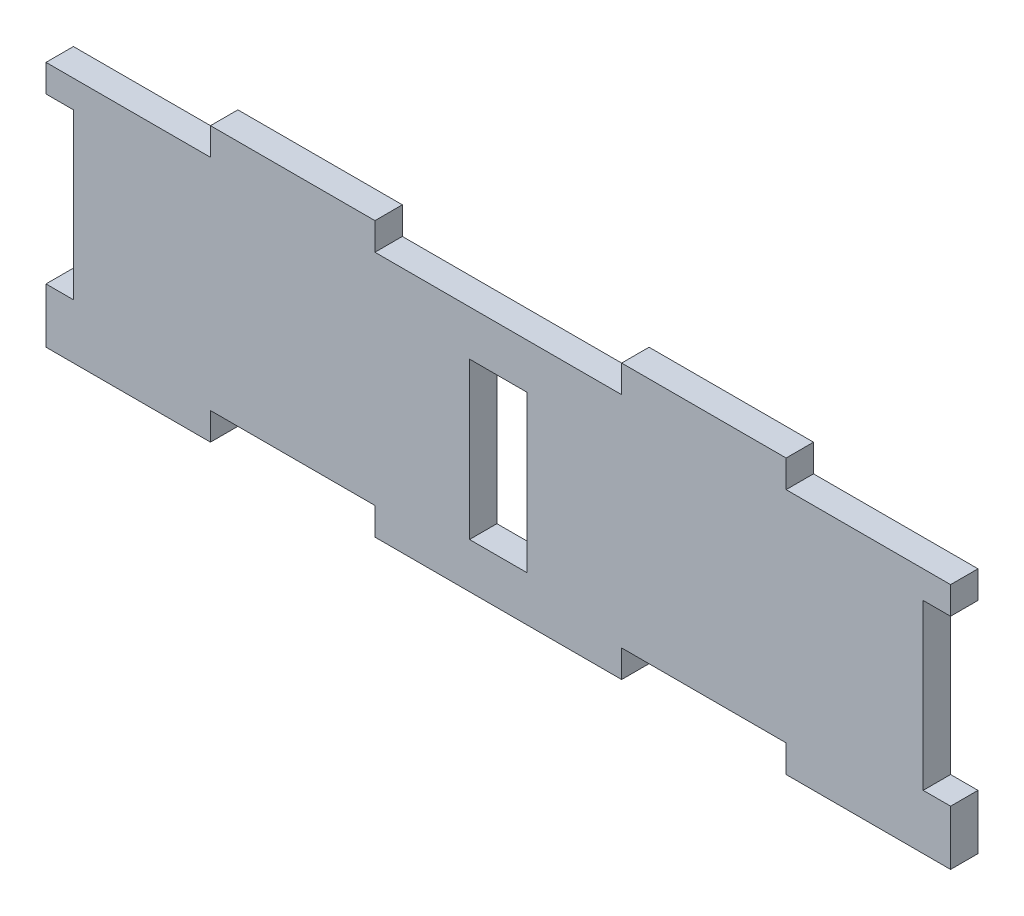
ISO-10303-21;
HEADER;
FILE_DESCRIPTION(('STEP AP214'),'2;1');
FILE_NAME('part.step','',(''),(''),'','','');
FILE_SCHEMA(('AUTOMOTIVE_DESIGN { 1 0 10303 214 1 1 1 1 }'));
ENDSEC;
DATA;
#1=APPLICATION_CONTEXT('core data for automotive mechanical design processes');
#2=APPLICATION_PROTOCOL_DEFINITION('international standard','automotive_design',2000,#1);
#3=PRODUCT_CONTEXT('',#1,'mechanical');
#4=PRODUCT('Part','Part','',(#3));
#5=PRODUCT_RELATED_PRODUCT_CATEGORY('part','',(#4));
#6=PRODUCT_DEFINITION_FORMATION('','',#4);
#7=PRODUCT_DEFINITION_CONTEXT('part definition',#1,'design');
#8=PRODUCT_DEFINITION('design','',#6,#7);
#9=PRODUCT_DEFINITION_SHAPE('','',#8);
#10=(LENGTH_UNIT() NAMED_UNIT(*) SI_UNIT(.MILLI.,.METRE.));
#11=(NAMED_UNIT(*) PLANE_ANGLE_UNIT() SI_UNIT($,.RADIAN.));
#12=(NAMED_UNIT(*) SI_UNIT($,.STERADIAN.) SOLID_ANGLE_UNIT());
#13=UNCERTAINTY_MEASURE_WITH_UNIT(LENGTH_MEASURE(1.E-05),#10,'distance_accuracy_value','');
#14=(GEOMETRIC_REPRESENTATION_CONTEXT(3) GLOBAL_UNCERTAINTY_ASSIGNED_CONTEXT((#13)) GLOBAL_UNIT_ASSIGNED_CONTEXT((#10,
#11,#12)) REPRESENTATION_CONTEXT('',''));
#15=CARTESIAN_POINT('',(0.,0.,0.));
#16=DIRECTION('',(0.,0.,1.));
#17=DIRECTION('',(1.,0.,0.));
#18=AXIS2_PLACEMENT_3D('',#15,#16,#17);
#19=CARTESIAN_POINT('',(-20.7430089491256,50.7784971444489,5.));
#20=DIRECTION('',(0.,0.,-1.));
#21=DIRECTION('',(-1.,0.,0.));
#22=AXIS2_PLACEMENT_3D('',#19,#20,#21);
#23=PLANE('',#22);
#24=DIRECTION('',(0.,-1.,0.));
#25=VECTOR('',#24,1.);
#26=CARTESIAN_POINT('',(-20.7430089491256,40.7784971444489,5.));
#27=LINE('',#26,#25);
#28=CARTESIAN_POINT('',(-20.7430089491256,50.7784971444489,5.));
#29=VERTEX_POINT('',#28);
#30=CARTESIAN_POINT('',(-20.7430089491256,40.7784971444489,5.));
#31=VERTEX_POINT('',#30);
#32=EDGE_CURVE('E277',#29,#31,#27,.T.);
#33=ORIENTED_EDGE('',*,*,#32,.T.);
#34=DIRECTION('',(1.,0.,0.));
#35=VECTOR('',#34,1.);
#36=CARTESIAN_POINT('',(-20.7430089491256,40.7784971444489,5.));
#37=LINE('',#36,#35);
#38=CARTESIAN_POINT('',(9.25699105087438,40.7784971444489,5.));
#39=VERTEX_POINT('',#38);
#40=EDGE_CURVE('E280',#31,#39,#37,.T.);
#41=ORIENTED_EDGE('',*,*,#40,.T.);
#42=DIRECTION('',(0.,1.,0.));
#43=VECTOR('',#42,1.);
#44=CARTESIAN_POINT('',(9.25699105087438,40.7784971444489,5.));
#45=LINE('',#44,#43);
#46=CARTESIAN_POINT('',(9.25699105087438,45.7784971444489,5.));
#47=VERTEX_POINT('',#46);
#48=EDGE_CURVE('E283',#39,#47,#45,.T.);
#49=ORIENTED_EDGE('',*,*,#48,.T.);
#50=DIRECTION('',(1.,0.,0.));
#51=VECTOR('',#50,1.);
#52=CARTESIAN_POINT('',(9.25699105087438,45.7784971444489,5.));
#53=LINE('',#52,#51);
#54=CARTESIAN_POINT('',(39.2569910508744,45.7784971444489,5.));
#55=VERTEX_POINT('',#54);
#56=EDGE_CURVE('E285',#47,#55,#53,.T.);
#57=ORIENTED_EDGE('',*,*,#56,.T.);
#58=DIRECTION('',(0.,-1.,0.));
#59=VECTOR('',#58,1.);
#60=CARTESIAN_POINT('',(39.2569910508744,40.7784971444489,5.));
#61=LINE('',#60,#59);
#62=CARTESIAN_POINT('',(39.2569910508744,40.7784971444489,5.));
#63=VERTEX_POINT('',#62);
#64=EDGE_CURVE('E287',#55,#63,#61,.T.);
#65=ORIENTED_EDGE('',*,*,#64,.T.);
#66=DIRECTION('',(1.,0.,0.));
#67=VECTOR('',#66,1.);
#68=CARTESIAN_POINT('',(39.2569910508744,40.7784971444489,5.));
#69=LINE('',#68,#67);
#70=CARTESIAN_POINT('',(84.2569910508744,40.7784971444489,5.));
#71=VERTEX_POINT('',#70);
#72=EDGE_CURVE('E289',#63,#71,#69,.T.);
#73=ORIENTED_EDGE('',*,*,#72,.T.);
#74=DIRECTION('',(0.,1.,0.));
#75=VECTOR('',#74,1.);
#76=CARTESIAN_POINT('',(84.2569910508744,40.7784971444489,5.));
#77=LINE('',#76,#75);
#78=CARTESIAN_POINT('',(84.2569910508744,45.7784971444489,5.));
#79=VERTEX_POINT('',#78);
#80=EDGE_CURVE('E291',#71,#79,#77,.T.);
#81=ORIENTED_EDGE('',*,*,#80,.T.);
#82=DIRECTION('',(1.,0.,0.));
#83=VECTOR('',#82,1.);
#84=CARTESIAN_POINT('',(84.2569910508744,45.7784971444489,5.));
#85=LINE('',#84,#83);
#86=CARTESIAN_POINT('',(114.256991050874,45.7784971444489,5.));
#87=VERTEX_POINT('',#86);
#88=EDGE_CURVE('E293',#79,#87,#85,.T.);
#89=ORIENTED_EDGE('',*,*,#88,.T.);
#90=DIRECTION('',(0.,-1.,0.));
#91=VECTOR('',#90,1.);
#92=CARTESIAN_POINT('',(114.256991050874,40.7784971444489,5.));
#93=LINE('',#92,#91);
#94=CARTESIAN_POINT('',(114.256991050874,40.7784971444489,5.));
#95=VERTEX_POINT('',#94);
#96=EDGE_CURVE('E295',#87,#95,#93,.T.);
#97=ORIENTED_EDGE('',*,*,#96,.T.);
#98=DIRECTION('',(1.,0.,0.));
#99=VECTOR('',#98,1.);
#100=CARTESIAN_POINT('',(114.256991050874,40.7784971444489,5.));
#101=LINE('',#100,#99);
#102=CARTESIAN_POINT('',(144.256991050874,40.7784971444489,5.));
#103=VERTEX_POINT('',#102);
#104=EDGE_CURVE('E297',#95,#103,#101,.T.);
#105=ORIENTED_EDGE('',*,*,#104,.T.);
#106=DIRECTION('',(0.,1.,0.));
#107=VECTOR('',#106,1.);
#108=CARTESIAN_POINT('',(144.256991050874,40.7784971444489,5.));
#109=LINE('',#108,#107);
#110=CARTESIAN_POINT('',(144.256991050874,50.7784971444489,5.));
#111=VERTEX_POINT('',#110);
#112=EDGE_CURVE('E299',#103,#111,#109,.T.);
#113=ORIENTED_EDGE('',*,*,#112,.T.);
#114=DIRECTION('',(-1.,0.,0.));
#115=VECTOR('',#114,1.);
#116=CARTESIAN_POINT('',(144.256991050874,50.7784971444489,5.));
#117=LINE('',#116,#115);
#118=CARTESIAN_POINT('',(139.256991050874,50.7784971444489,5.));
#119=VERTEX_POINT('',#118);
#120=EDGE_CURVE('E301',#111,#119,#117,.T.);
#121=ORIENTED_EDGE('',*,*,#120,.T.);
#122=DIRECTION('',(0.,1.,0.));
#123=VECTOR('',#122,1.);
#124=CARTESIAN_POINT('',(139.256991050874,50.7784971444489,5.));
#125=LINE('',#124,#123);
#126=CARTESIAN_POINT('',(139.256991050874,80.7784971444489,5.));
#127=VERTEX_POINT('',#126);
#128=EDGE_CURVE('E303',#119,#127,#125,.T.);
#129=ORIENTED_EDGE('',*,*,#128,.T.);
#130=DIRECTION('',(1.,0.,0.));
#131=VECTOR('',#130,1.);
#132=CARTESIAN_POINT('',(144.256991050874,80.7784971444489,5.));
#133=LINE('',#132,#131);
#134=CARTESIAN_POINT('',(144.256991050874,80.7784971444489,5.));
#135=VERTEX_POINT('',#134);
#136=EDGE_CURVE('E305',#127,#135,#133,.T.);
#137=ORIENTED_EDGE('',*,*,#136,.T.);
#138=DIRECTION('',(0.,1.,0.));
#139=VECTOR('',#138,1.);
#140=CARTESIAN_POINT('',(144.256991050874,80.7784971444489,5.));
#141=LINE('',#140,#139);
#142=CARTESIAN_POINT('',(144.256991050874,85.7784971444489,5.));
#143=VERTEX_POINT('',#142);
#144=EDGE_CURVE('E307',#135,#143,#141,.T.);
#145=ORIENTED_EDGE('',*,*,#144,.T.);
#146=DIRECTION('',(-1.,0.,0.));
#147=VECTOR('',#146,1.);
#148=CARTESIAN_POINT('',(114.256991050874,85.7784971444489,5.));
#149=LINE('',#148,#147);
#150=CARTESIAN_POINT('',(114.256991050874,85.7784971444489,5.));
#151=VERTEX_POINT('',#150);
#152=EDGE_CURVE('E309',#143,#151,#149,.T.);
#153=ORIENTED_EDGE('',*,*,#152,.T.);
#154=DIRECTION('',(0.,1.,0.));
#155=VECTOR('',#154,1.);
#156=CARTESIAN_POINT('',(114.256991050874,85.7784971444489,5.));
#157=LINE('',#156,#155);
#158=CARTESIAN_POINT('',(114.256991050874,90.7784971444489,5.));
#159=VERTEX_POINT('',#158);
#160=EDGE_CURVE('E311',#151,#159,#157,.T.);
#161=ORIENTED_EDGE('',*,*,#160,.T.);
#162=DIRECTION('',(-1.,0.,0.));
#163=VECTOR('',#162,1.);
#164=CARTESIAN_POINT('',(84.2569910508744,90.7784971444489,5.));
#165=LINE('',#164,#163);
#166=CARTESIAN_POINT('',(84.2569910508744,90.7784971444489,5.));
#167=VERTEX_POINT('',#166);
#168=EDGE_CURVE('E313',#159,#167,#165,.T.);
#169=ORIENTED_EDGE('',*,*,#168,.T.);
#170=DIRECTION('',(0.,-1.,0.));
#171=VECTOR('',#170,1.);
#172=CARTESIAN_POINT('',(84.2569910508744,85.7784971444489,5.));
#173=LINE('',#172,#171);
#174=CARTESIAN_POINT('',(84.2569910508744,85.7784971444489,5.));
#175=VERTEX_POINT('',#174);
#176=EDGE_CURVE('E315',#167,#175,#173,.T.);
#177=ORIENTED_EDGE('',*,*,#176,.T.);
#178=DIRECTION('',(-1.,0.,0.));
#179=VECTOR('',#178,1.);
#180=CARTESIAN_POINT('',(39.2569910508744,85.7784971444489,5.));
#181=LINE('',#180,#179);
#182=CARTESIAN_POINT('',(39.2569910508744,85.7784971444489,5.));
#183=VERTEX_POINT('',#182);
#184=EDGE_CURVE('E317',#175,#183,#181,.T.);
#185=ORIENTED_EDGE('',*,*,#184,.T.);
#186=DIRECTION('',(0.,1.,0.));
#187=VECTOR('',#186,1.);
#188=CARTESIAN_POINT('',(39.2569910508744,85.7784971444489,5.));
#189=LINE('',#188,#187);
#190=CARTESIAN_POINT('',(39.2569910508744,90.7784971444489,5.));
#191=VERTEX_POINT('',#190);
#192=EDGE_CURVE('E319',#183,#191,#189,.T.);
#193=ORIENTED_EDGE('',*,*,#192,.T.);
#194=DIRECTION('',(-1.,0.,0.));
#195=VECTOR('',#194,1.);
#196=CARTESIAN_POINT('',(9.25699105087438,90.7784971444489,5.));
#197=LINE('',#196,#195);
#198=CARTESIAN_POINT('',(9.25699105087438,90.7784971444489,5.));
#199=VERTEX_POINT('',#198);
#200=EDGE_CURVE('E321',#191,#199,#197,.T.);
#201=ORIENTED_EDGE('',*,*,#200,.T.);
#202=DIRECTION('',(0.,-1.,0.));
#203=VECTOR('',#202,1.);
#204=CARTESIAN_POINT('',(9.25699105087438,85.7784971444489,5.));
#205=LINE('',#204,#203);
#206=CARTESIAN_POINT('',(9.25699105087438,85.7784971444489,5.));
#207=VERTEX_POINT('',#206);
#208=EDGE_CURVE('E323',#199,#207,#205,.T.);
#209=ORIENTED_EDGE('',*,*,#208,.T.);
#210=DIRECTION('',(-1.,0.,0.));
#211=VECTOR('',#210,1.);
#212=CARTESIAN_POINT('',(-20.7430089491256,85.7784971444489,5.));
#213=LINE('',#212,#211);
#214=CARTESIAN_POINT('',(-20.7430089491256,85.7784971444489,5.));
#215=VERTEX_POINT('',#214);
#216=EDGE_CURVE('E325',#207,#215,#213,.T.);
#217=ORIENTED_EDGE('',*,*,#216,.T.);
#218=DIRECTION('',(0.,-1.,0.));
#219=VECTOR('',#218,1.);
#220=CARTESIAN_POINT('',(-20.7430089491256,80.7784971444489,5.));
#221=LINE('',#220,#219);
#222=CARTESIAN_POINT('',(-20.7430089491256,80.7784971444489,5.));
#223=VERTEX_POINT('',#222);
#224=EDGE_CURVE('E327',#215,#223,#221,.T.);
#225=ORIENTED_EDGE('',*,*,#224,.T.);
#226=DIRECTION('',(1.,0.,0.));
#227=VECTOR('',#226,1.);
#228=CARTESIAN_POINT('',(-20.7430089491256,80.7784971444489,5.));
#229=LINE('',#228,#227);
#230=CARTESIAN_POINT('',(-15.7430089491256,80.7784971444489,5.));
#231=VERTEX_POINT('',#230);
#232=EDGE_CURVE('E329',#223,#231,#229,.T.);
#233=ORIENTED_EDGE('',*,*,#232,.T.);
#234=DIRECTION('',(0.,-1.,0.));
#235=VECTOR('',#234,1.);
#236=CARTESIAN_POINT('',(-15.7430089491256,50.7784971444489,5.));
#237=LINE('',#236,#235);
#238=CARTESIAN_POINT('',(-15.7430089491256,50.7784971444489,5.));
#239=VERTEX_POINT('',#238);
#240=EDGE_CURVE('E331',#231,#239,#237,.T.);
#241=ORIENTED_EDGE('',*,*,#240,.T.);
#242=DIRECTION('',(-1.,0.,0.));
#243=VECTOR('',#242,1.);
#244=CARTESIAN_POINT('',(-20.7430089491256,50.7784971444489,5.));
#245=LINE('',#244,#243);
#246=EDGE_CURVE('E333',#239,#29,#245,.T.);
#247=ORIENTED_EDGE('',*,*,#246,.T.);
#248=EDGE_LOOP('',(#33,#41,#49,#57,#65,#73,#81,#89,#97,#105,#113,#121,#129,#137,#145,#153,#161,
#169,#177,#185,#193,#201,#209,#217,#225,#233,#241,#247));
#249=FACE_BOUND('',#248,.T.);
#250=DIRECTION('',(0.,1.,0.));
#251=VECTOR('',#250,1.);
#252=CARTESIAN_POINT('',(67.0069910508743,77.5284971444489,5.));
#253=LINE('',#252,#251);
#254=CARTESIAN_POINT('',(67.0069910508744,49.0284971444489,5.));
#255=VERTEX_POINT('',#254);
#256=CARTESIAN_POINT('',(67.0069910508743,77.5284971444489,5.));
#257=VERTEX_POINT('',#256);
#258=EDGE_CURVE('E241',#255,#257,#253,.T.);
#259=ORIENTED_EDGE('',*,*,#258,.F.);
#260=DIRECTION('',(1.,0.,0.));
#261=VECTOR('',#260,1.);
#262=CARTESIAN_POINT('',(67.0069910508744,49.0284971444489,5.));
#263=LINE('',#262,#261);
#264=CARTESIAN_POINT('',(56.5069910508744,49.0284971444489,5.));
#265=VERTEX_POINT('',#264);
#266=EDGE_CURVE('E263',#265,#255,#263,.T.);
#267=ORIENTED_EDGE('',*,*,#266,.F.);
#268=DIRECTION('',(0.,-1.,0.));
#269=VECTOR('',#268,1.);
#270=CARTESIAN_POINT('',(56.5069910508744,77.5284971444489,5.));
#271=LINE('',#270,#269);
#272=CARTESIAN_POINT('',(56.5069910508744,77.5284971444489,5.));
#273=VERTEX_POINT('',#272);
#274=EDGE_CURVE('E261',#273,#265,#271,.T.);
#275=ORIENTED_EDGE('',*,*,#274,.F.);
#276=DIRECTION('',(-1.,0.,0.));
#277=VECTOR('',#276,1.);
#278=CARTESIAN_POINT('',(67.0069910508743,77.5284971444489,5.));
#279=LINE('',#278,#277);
#280=EDGE_CURVE('E249',#257,#273,#279,.T.);
#281=ORIENTED_EDGE('',*,*,#280,.F.);
#282=EDGE_LOOP('',(#259,#267,#275,#281));
#283=FACE_BOUND('',#282,.T.);
#284=ADVANCED_FACE('F32',(#249,#283),#23,.F.);
#285=CARTESIAN_POINT('',(-20.7430089491256,50.7784971444489,0.));
#286=DIRECTION('',(0.,0.,-1.));
#287=DIRECTION('',(-1.,0.,0.));
#288=AXIS2_PLACEMENT_3D('',#285,#286,#287);
#289=PLANE('',#288);
#290=DIRECTION('',(0.,-1.,0.));
#291=VECTOR('',#290,1.);
#292=CARTESIAN_POINT('',(-20.7430089491256,40.7784971444489,0.));
#293=LINE('',#292,#291);
#294=CARTESIAN_POINT('',(-20.7430089491256,50.7784971444489,0.));
#295=VERTEX_POINT('',#294);
#296=CARTESIAN_POINT('',(-20.7430089491256,40.7784971444489,0.));
#297=VERTEX_POINT('',#296);
#298=EDGE_CURVE('E257',#295,#297,#293,.T.);
#299=ORIENTED_EDGE('',*,*,#298,.F.);
#300=DIRECTION('',(-1.,0.,0.));
#301=VECTOR('',#300,1.);
#302=CARTESIAN_POINT('',(-20.7430089491256,50.7784971444489,0.));
#303=LINE('',#302,#301);
#304=CARTESIAN_POINT('',(-15.7430089491256,50.7784971444489,0.));
#305=VERTEX_POINT('',#304);
#306=EDGE_CURVE('E281',#305,#295,#303,.T.);
#307=ORIENTED_EDGE('',*,*,#306,.F.);
#308=DIRECTION('',(0.,-1.,0.));
#309=VECTOR('',#308,1.);
#310=CARTESIAN_POINT('',(-15.7430089491256,50.7784971444489,0.));
#311=LINE('',#310,#309);
#312=CARTESIAN_POINT('',(-15.7430089491256,80.7784971444489,0.));
#313=VERTEX_POINT('',#312);
#314=EDGE_CURVE('E388',#313,#305,#311,.T.);
#315=ORIENTED_EDGE('',*,*,#314,.F.);
#316=DIRECTION('',(1.,0.,0.));
#317=VECTOR('',#316,1.);
#318=CARTESIAN_POINT('',(-20.7430089491256,80.7784971444489,0.));
#319=LINE('',#318,#317);
#320=CARTESIAN_POINT('',(-20.7430089491256,80.7784971444489,0.));
#321=VERTEX_POINT('',#320);
#322=EDGE_CURVE('E386',#321,#313,#319,.T.);
#323=ORIENTED_EDGE('',*,*,#322,.F.);
#324=DIRECTION('',(0.,-1.,0.));
#325=VECTOR('',#324,1.);
#326=CARTESIAN_POINT('',(-20.7430089491256,80.7784971444489,0.));
#327=LINE('',#326,#325);
#328=CARTESIAN_POINT('',(-20.7430089491256,85.7784971444489,0.));
#329=VERTEX_POINT('',#328);
#330=EDGE_CURVE('E384',#329,#321,#327,.T.);
#331=ORIENTED_EDGE('',*,*,#330,.F.);
#332=DIRECTION('',(-1.,0.,0.));
#333=VECTOR('',#332,1.);
#334=CARTESIAN_POINT('',(-20.7430089491256,85.7784971444489,0.));
#335=LINE('',#334,#333);
#336=CARTESIAN_POINT('',(9.25699105087438,85.7784971444489,0.));
#337=VERTEX_POINT('',#336);
#338=EDGE_CURVE('E382',#337,#329,#335,.T.);
#339=ORIENTED_EDGE('',*,*,#338,.F.);
#340=DIRECTION('',(0.,-1.,0.));
#341=VECTOR('',#340,1.);
#342=CARTESIAN_POINT('',(9.25699105087438,85.7784971444489,0.));
#343=LINE('',#342,#341);
#344=CARTESIAN_POINT('',(9.25699105087438,90.7784971444489,0.));
#345=VERTEX_POINT('',#344);
#346=EDGE_CURVE('E380',#345,#337,#343,.T.);
#347=ORIENTED_EDGE('',*,*,#346,.F.);
#348=DIRECTION('',(-1.,0.,0.));
#349=VECTOR('',#348,1.);
#350=CARTESIAN_POINT('',(9.25699105087438,90.7784971444489,0.));
#351=LINE('',#350,#349);
#352=CARTESIAN_POINT('',(39.2569910508744,90.7784971444489,0.));
#353=VERTEX_POINT('',#352);
#354=EDGE_CURVE('E378',#353,#345,#351,.T.);
#355=ORIENTED_EDGE('',*,*,#354,.F.);
#356=DIRECTION('',(0.,1.,0.));
#357=VECTOR('',#356,1.);
#358=CARTESIAN_POINT('',(39.2569910508744,85.7784971444489,0.));
#359=LINE('',#358,#357);
#360=CARTESIAN_POINT('',(39.2569910508744,85.7784971444489,0.));
#361=VERTEX_POINT('',#360);
#362=EDGE_CURVE('E376',#361,#353,#359,.T.);
#363=ORIENTED_EDGE('',*,*,#362,.F.);
#364=DIRECTION('',(-1.,0.,0.));
#365=VECTOR('',#364,1.);
#366=CARTESIAN_POINT('',(39.2569910508744,85.7784971444489,0.));
#367=LINE('',#366,#365);
#368=CARTESIAN_POINT('',(84.2569910508744,85.7784971444489,0.));
#369=VERTEX_POINT('',#368);
#370=EDGE_CURVE('E374',#369,#361,#367,.T.);
#371=ORIENTED_EDGE('',*,*,#370,.F.);
#372=DIRECTION('',(0.,-1.,0.));
#373=VECTOR('',#372,1.);
#374=CARTESIAN_POINT('',(84.2569910508744,85.7784971444489,0.));
#375=LINE('',#374,#373);
#376=CARTESIAN_POINT('',(84.2569910508744,90.7784971444489,0.));
#377=VERTEX_POINT('',#376);
#378=EDGE_CURVE('E372',#377,#369,#375,.T.);
#379=ORIENTED_EDGE('',*,*,#378,.F.);
#380=DIRECTION('',(-1.,0.,0.));
#381=VECTOR('',#380,1.);
#382=CARTESIAN_POINT('',(84.2569910508744,90.7784971444489,0.));
#383=LINE('',#382,#381);
#384=CARTESIAN_POINT('',(114.256991050874,90.7784971444489,0.));
#385=VERTEX_POINT('',#384);
#386=EDGE_CURVE('E370',#385,#377,#383,.T.);
#387=ORIENTED_EDGE('',*,*,#386,.F.);
#388=DIRECTION('',(0.,1.,0.));
#389=VECTOR('',#388,1.);
#390=CARTESIAN_POINT('',(114.256991050874,85.7784971444489,0.));
#391=LINE('',#390,#389);
#392=CARTESIAN_POINT('',(114.256991050874,85.7784971444489,0.));
#393=VERTEX_POINT('',#392);
#394=EDGE_CURVE('E368',#393,#385,#391,.T.);
#395=ORIENTED_EDGE('',*,*,#394,.F.);
#396=DIRECTION('',(-1.,0.,0.));
#397=VECTOR('',#396,1.);
#398=CARTESIAN_POINT('',(114.256991050874,85.7784971444489,0.));
#399=LINE('',#398,#397);
#400=CARTESIAN_POINT('',(144.256991050874,85.7784971444489,0.));
#401=VERTEX_POINT('',#400);
#402=EDGE_CURVE('E366',#401,#393,#399,.T.);
#403=ORIENTED_EDGE('',*,*,#402,.F.);
#404=DIRECTION('',(0.,1.,0.));
#405=VECTOR('',#404,1.);
#406=CARTESIAN_POINT('',(144.256991050874,80.7784971444489,0.));
#407=LINE('',#406,#405);
#408=CARTESIAN_POINT('',(144.256991050874,80.7784971444489,0.));
#409=VERTEX_POINT('',#408);
#410=EDGE_CURVE('E364',#409,#401,#407,.T.);
#411=ORIENTED_EDGE('',*,*,#410,.F.);
#412=DIRECTION('',(1.,0.,0.));
#413=VECTOR('',#412,1.);
#414=CARTESIAN_POINT('',(144.256991050874,80.7784971444489,0.));
#415=LINE('',#414,#413);
#416=CARTESIAN_POINT('',(139.256991050874,80.7784971444489,0.));
#417=VERTEX_POINT('',#416);
#418=EDGE_CURVE('E362',#417,#409,#415,.T.);
#419=ORIENTED_EDGE('',*,*,#418,.F.);
#420=DIRECTION('',(0.,1.,0.));
#421=VECTOR('',#420,1.);
#422=CARTESIAN_POINT('',(139.256991050874,50.7784971444489,0.));
#423=LINE('',#422,#421);
#424=CARTESIAN_POINT('',(139.256991050874,50.7784971444489,0.));
#425=VERTEX_POINT('',#424);
#426=EDGE_CURVE('E360',#425,#417,#423,.T.);
#427=ORIENTED_EDGE('',*,*,#426,.F.);
#428=DIRECTION('',(-1.,0.,0.));
#429=VECTOR('',#428,1.);
#430=CARTESIAN_POINT('',(144.256991050874,50.7784971444489,0.));
#431=LINE('',#430,#429);
#432=CARTESIAN_POINT('',(144.256991050874,50.7784971444489,0.));
#433=VERTEX_POINT('',#432);
#434=EDGE_CURVE('E358',#433,#425,#431,.T.);
#435=ORIENTED_EDGE('',*,*,#434,.F.);
#436=DIRECTION('',(0.,1.,0.));
#437=VECTOR('',#436,1.);
#438=CARTESIAN_POINT('',(144.256991050874,40.7784971444489,0.));
#439=LINE('',#438,#437);
#440=CARTESIAN_POINT('',(144.256991050874,40.7784971444489,0.));
#441=VERTEX_POINT('',#440);
#442=EDGE_CURVE('E356',#441,#433,#439,.T.);
#443=ORIENTED_EDGE('',*,*,#442,.F.);
#444=DIRECTION('',(1.,0.,0.));
#445=VECTOR('',#444,1.);
#446=CARTESIAN_POINT('',(114.256991050874,40.7784971444489,0.));
#447=LINE('',#446,#445);
#448=CARTESIAN_POINT('',(114.256991050874,40.7784971444489,0.));
#449=VERTEX_POINT('',#448);
#450=EDGE_CURVE('E354',#449,#441,#447,.T.);
#451=ORIENTED_EDGE('',*,*,#450,.F.);
#452=DIRECTION('',(0.,-1.,0.));
#453=VECTOR('',#452,1.);
#454=CARTESIAN_POINT('',(114.256991050874,40.7784971444489,0.));
#455=LINE('',#454,#453);
#456=CARTESIAN_POINT('',(114.256991050874,45.7784971444489,0.));
#457=VERTEX_POINT('',#456);
#458=EDGE_CURVE('E352',#457,#449,#455,.T.);
#459=ORIENTED_EDGE('',*,*,#458,.F.);
#460=DIRECTION('',(1.,0.,0.));
#461=VECTOR('',#460,1.);
#462=CARTESIAN_POINT('',(84.2569910508744,45.7784971444489,0.));
#463=LINE('',#462,#461);
#464=CARTESIAN_POINT('',(84.2569910508744,45.7784971444489,0.));
#465=VERTEX_POINT('',#464);
#466=EDGE_CURVE('E350',#465,#457,#463,.T.);
#467=ORIENTED_EDGE('',*,*,#466,.F.);
#468=DIRECTION('',(0.,1.,0.));
#469=VECTOR('',#468,1.);
#470=CARTESIAN_POINT('',(84.2569910508744,40.7784971444489,0.));
#471=LINE('',#470,#469);
#472=CARTESIAN_POINT('',(84.2569910508744,40.7784971444489,0.));
#473=VERTEX_POINT('',#472);
#474=EDGE_CURVE('E348',#473,#465,#471,.T.);
#475=ORIENTED_EDGE('',*,*,#474,.F.);
#476=DIRECTION('',(1.,0.,0.));
#477=VECTOR('',#476,1.);
#478=CARTESIAN_POINT('',(39.2569910508744,40.7784971444489,0.));
#479=LINE('',#478,#477);
#480=CARTESIAN_POINT('',(39.2569910508744,40.7784971444489,0.));
#481=VERTEX_POINT('',#480);
#482=EDGE_CURVE('E346',#481,#473,#479,.T.);
#483=ORIENTED_EDGE('',*,*,#482,.F.);
#484=DIRECTION('',(0.,-1.,0.));
#485=VECTOR('',#484,1.);
#486=CARTESIAN_POINT('',(39.2569910508744,40.7784971444489,0.));
#487=LINE('',#486,#485);
#488=CARTESIAN_POINT('',(39.2569910508744,45.7784971444489,0.));
#489=VERTEX_POINT('',#488);
#490=EDGE_CURVE('E344',#489,#481,#487,.T.);
#491=ORIENTED_EDGE('',*,*,#490,.F.);
#492=DIRECTION('',(1.,0.,0.));
#493=VECTOR('',#492,1.);
#494=CARTESIAN_POINT('',(9.25699105087438,45.7784971444489,0.));
#495=LINE('',#494,#493);
#496=CARTESIAN_POINT('',(9.25699105087438,45.7784971444489,0.));
#497=VERTEX_POINT('',#496);
#498=EDGE_CURVE('E342',#497,#489,#495,.T.);
#499=ORIENTED_EDGE('',*,*,#498,.F.);
#500=DIRECTION('',(0.,1.,0.));
#501=VECTOR('',#500,1.);
#502=CARTESIAN_POINT('',(9.25699105087438,40.7784971444489,0.));
#503=LINE('',#502,#501);
#504=CARTESIAN_POINT('',(9.25699105087438,40.7784971444489,0.));
#505=VERTEX_POINT('',#504);
#506=EDGE_CURVE('E340',#505,#497,#503,.T.);
#507=ORIENTED_EDGE('',*,*,#506,.F.);
#508=DIRECTION('',(1.,0.,0.));
#509=VECTOR('',#508,1.);
#510=CARTESIAN_POINT('',(-20.7430089491256,40.7784971444489,0.));
#511=LINE('',#510,#509);
#512=EDGE_CURVE('E338',#297,#505,#511,.T.);
#513=ORIENTED_EDGE('',*,*,#512,.F.);
#514=EDGE_LOOP('',(#299,#307,#315,#323,#331,#339,#347,#355,#363,#371,#379,#387,#395,#403,#411,
#419,#427,#435,#443,#451,#459,#467,#475,#483,#491,#499,#507,#513));
#515=FACE_BOUND('',#514,.T.);
#516=DIRECTION('',(1.,0.,0.));
#517=VECTOR('',#516,1.);
#518=CARTESIAN_POINT('',(67.0069910508744,49.0284971444489,0.));
#519=LINE('',#518,#517);
#520=CARTESIAN_POINT('',(56.5069910508744,49.0284971444489,0.));
#521=VERTEX_POINT('',#520);
#522=CARTESIAN_POINT('',(67.0069910508744,49.0284971444489,0.));
#523=VERTEX_POINT('',#522);
#524=EDGE_CURVE('E250',#521,#523,#519,.T.);
#525=ORIENTED_EDGE('',*,*,#524,.T.);
#526=DIRECTION('',(0.,1.,0.));
#527=VECTOR('',#526,1.);
#528=CARTESIAN_POINT('',(67.0069910508743,77.5284971444489,0.));
#529=LINE('',#528,#527);
#530=CARTESIAN_POINT('',(67.0069910508743,77.5284971444489,0.));
#531=VERTEX_POINT('',#530);
#532=EDGE_CURVE('E55',#523,#531,#529,.T.);
#533=ORIENTED_EDGE('',*,*,#532,.T.);
#534=DIRECTION('',(-1.,0.,0.));
#535=VECTOR('',#534,1.);
#536=CARTESIAN_POINT('',(67.0069910508743,77.5284971444489,0.));
#537=LINE('',#536,#535);
#538=CARTESIAN_POINT('',(56.5069910508744,77.5284971444489,0.));
#539=VERTEX_POINT('',#538);
#540=EDGE_CURVE('E256',#531,#539,#537,.T.);
#541=ORIENTED_EDGE('',*,*,#540,.T.);
#542=DIRECTION('',(0.,-1.,0.));
#543=VECTOR('',#542,1.);
#544=CARTESIAN_POINT('',(56.5069910508744,77.5284971444489,0.));
#545=LINE('',#544,#543);
#546=EDGE_CURVE('E269',#539,#521,#545,.T.);
#547=ORIENTED_EDGE('',*,*,#546,.T.);
#548=EDGE_LOOP('',(#525,#533,#541,#547));
#549=FACE_BOUND('',#548,.T.);
#550=ADVANCED_FACE('F478',(#515,#549),#289,.T.);
#551=CARTESIAN_POINT('',(-20.7430089491256,40.7784971444489,5.));
#552=DIRECTION('',(1.,0.,0.));
#553=DIRECTION('',(0.,0.,-1.));
#554=AXIS2_PLACEMENT_3D('',#551,#552,#553);
#555=PLANE('',#554);
#556=ORIENTED_EDGE('',*,*,#298,.T.);
#557=DIRECTION('',(0.,0.,-1.));
#558=VECTOR('',#557,1.);
#559=CARTESIAN_POINT('',(-20.7430089491256,40.7784971444489,5.));
#560=LINE('',#559,#558);
#561=EDGE_CURVE('E11',#31,#297,#560,.T.);
#562=ORIENTED_EDGE('',*,*,#561,.F.);
#563=ORIENTED_EDGE('',*,*,#32,.F.);
#564=DIRECTION('',(0.,0.,-1.));
#565=VECTOR('',#564,1.);
#566=CARTESIAN_POINT('',(-20.7430089491256,50.7784971444489,5.));
#567=LINE('',#566,#565);
#568=EDGE_CURVE('E335',#29,#295,#567,.T.);
#569=ORIENTED_EDGE('',*,*,#568,.T.);
#570=EDGE_LOOP('',(#556,#562,#563,#569));
#571=FACE_BOUND('',#570,.T.);
#572=ADVANCED_FACE('F34',(#571),#555,.F.);
#573=CARTESIAN_POINT('',(-20.7430089491256,40.7784971444489,5.));
#574=DIRECTION('',(0.,1.,0.));
#575=DIRECTION('',(0.,0.,1.));
#576=AXIS2_PLACEMENT_3D('',#573,#574,#575);
#577=PLANE('',#576);
#578=ORIENTED_EDGE('',*,*,#512,.T.);
#579=DIRECTION('',(0.,0.,-1.));
#580=VECTOR('',#579,1.);
#581=CARTESIAN_POINT('',(9.25699105087438,40.7784971444489,5.));
#582=LINE('',#581,#580);
#583=EDGE_CURVE('E40',#39,#505,#582,.T.);
#584=ORIENTED_EDGE('',*,*,#583,.F.);
#585=ORIENTED_EDGE('',*,*,#40,.F.);
#586=ORIENTED_EDGE('',*,*,#561,.T.);
#587=EDGE_LOOP('',(#578,#584,#585,#586));
#588=FACE_BOUND('',#587,.T.);
#589=ADVANCED_FACE('F495',(#588),#577,.F.);
#590=CARTESIAN_POINT('',(9.25699105087438,40.7784971444489,5.));
#591=DIRECTION('',(-1.,0.,0.));
#592=DIRECTION('',(0.,0.,1.));
#593=AXIS2_PLACEMENT_3D('',#590,#591,#592);
#594=PLANE('',#593);
#595=ORIENTED_EDGE('',*,*,#506,.T.);
#596=DIRECTION('',(0.,0.,-1.));
#597=VECTOR('',#596,1.);
#598=CARTESIAN_POINT('',(9.25699105087438,45.7784971444489,5.));
#599=LINE('',#598,#597);
#600=EDGE_CURVE('E465',#47,#497,#599,.T.);
#601=ORIENTED_EDGE('',*,*,#600,.F.);
#602=ORIENTED_EDGE('',*,*,#48,.F.);
#603=ORIENTED_EDGE('',*,*,#583,.T.);
#604=EDGE_LOOP('',(#595,#601,#602,#603));
#605=FACE_BOUND('',#604,.T.);
#606=ADVANCED_FACE('F472',(#605),#594,.F.);
#607=CARTESIAN_POINT('',(9.25699105087438,45.7784971444489,5.));
#608=DIRECTION('',(0.,1.,0.));
#609=DIRECTION('',(0.,0.,1.));
#610=AXIS2_PLACEMENT_3D('',#607,#608,#609);
#611=PLANE('',#610);
#612=ORIENTED_EDGE('',*,*,#498,.T.);
#613=DIRECTION('',(0.,0.,-1.));
#614=VECTOR('',#613,1.);
#615=CARTESIAN_POINT('',(39.2569910508744,45.7784971444489,5.));
#616=LINE('',#615,#614);
#617=EDGE_CURVE('E462',#55,#489,#616,.T.);
#618=ORIENTED_EDGE('',*,*,#617,.F.);
#619=ORIENTED_EDGE('',*,*,#56,.F.);
#620=ORIENTED_EDGE('',*,*,#600,.T.);
#621=EDGE_LOOP('',(#612,#618,#619,#620));
#622=FACE_BOUND('',#621,.T.);
#623=ADVANCED_FACE('F484',(#622),#611,.F.);
#624=CARTESIAN_POINT('',(39.2569910508744,40.7784971444489,5.));
#625=DIRECTION('',(1.,0.,0.));
#626=DIRECTION('',(0.,0.,-1.));
#627=AXIS2_PLACEMENT_3D('',#624,#625,#626);
#628=PLANE('',#627);
#629=ORIENTED_EDGE('',*,*,#490,.T.);
#630=DIRECTION('',(0.,0.,-1.));
#631=VECTOR('',#630,1.);
#632=CARTESIAN_POINT('',(39.2569910508744,40.7784971444489,5.));
#633=LINE('',#632,#631);
#634=EDGE_CURVE('E459',#63,#481,#633,.T.);
#635=ORIENTED_EDGE('',*,*,#634,.F.);
#636=ORIENTED_EDGE('',*,*,#64,.F.);
#637=ORIENTED_EDGE('',*,*,#617,.T.);
#638=EDGE_LOOP('',(#629,#635,#636,#637));
#639=FACE_BOUND('',#638,.T.);
#640=ADVANCED_FACE('F488',(#639),#628,.F.);
#641=CARTESIAN_POINT('',(39.2569910508744,40.7784971444489,5.));
#642=DIRECTION('',(0.,1.,0.));
#643=DIRECTION('',(0.,0.,1.));
#644=AXIS2_PLACEMENT_3D('',#641,#642,#643);
#645=PLANE('',#644);
#646=ORIENTED_EDGE('',*,*,#482,.T.);
#647=DIRECTION('',(0.,0.,-1.));
#648=VECTOR('',#647,1.);
#649=CARTESIAN_POINT('',(84.2569910508744,40.7784971444489,5.));
#650=LINE('',#649,#648);
#651=EDGE_CURVE('E456',#71,#473,#650,.T.);
#652=ORIENTED_EDGE('',*,*,#651,.F.);
#653=ORIENTED_EDGE('',*,*,#72,.F.);
#654=ORIENTED_EDGE('',*,*,#634,.T.);
#655=EDGE_LOOP('',(#646,#652,#653,#654));
#656=FACE_BOUND('',#655,.T.);
#657=ADVANCED_FACE('F608',(#656),#645,.F.);
#658=CARTESIAN_POINT('',(84.2569910508744,40.7784971444489,5.));
#659=DIRECTION('',(-1.,0.,0.));
#660=DIRECTION('',(0.,0.,1.));
#661=AXIS2_PLACEMENT_3D('',#658,#659,#660);
#662=PLANE('',#661);
#663=ORIENTED_EDGE('',*,*,#474,.T.);
#664=DIRECTION('',(0.,0.,-1.));
#665=VECTOR('',#664,1.);
#666=CARTESIAN_POINT('',(84.2569910508744,45.7784971444489,5.));
#667=LINE('',#666,#665);
#668=EDGE_CURVE('E453',#79,#465,#667,.T.);
#669=ORIENTED_EDGE('',*,*,#668,.F.);
#670=ORIENTED_EDGE('',*,*,#80,.F.);
#671=ORIENTED_EDGE('',*,*,#651,.T.);
#672=EDGE_LOOP('',(#663,#669,#670,#671));
#673=FACE_BOUND('',#672,.T.);
#674=ADVANCED_FACE('F605',(#673),#662,.F.);
#675=CARTESIAN_POINT('',(84.2569910508744,45.7784971444489,5.));
#676=DIRECTION('',(0.,1.,0.));
#677=DIRECTION('',(0.,0.,1.));
#678=AXIS2_PLACEMENT_3D('',#675,#676,#677);
#679=PLANE('',#678);
#680=ORIENTED_EDGE('',*,*,#466,.T.);
#681=DIRECTION('',(0.,0.,-1.));
#682=VECTOR('',#681,1.);
#683=CARTESIAN_POINT('',(114.256991050874,45.7784971444489,5.));
#684=LINE('',#683,#682);
#685=EDGE_CURVE('E450',#87,#457,#684,.T.);
#686=ORIENTED_EDGE('',*,*,#685,.F.);
#687=ORIENTED_EDGE('',*,*,#88,.F.);
#688=ORIENTED_EDGE('',*,*,#668,.T.);
#689=EDGE_LOOP('',(#680,#686,#687,#688));
#690=FACE_BOUND('',#689,.T.);
#691=ADVANCED_FACE('F601',(#690),#679,.F.);
#692=CARTESIAN_POINT('',(114.256991050874,40.7784971444489,5.));
#693=DIRECTION('',(1.,0.,0.));
#694=DIRECTION('',(0.,0.,-1.));
#695=AXIS2_PLACEMENT_3D('',#692,#693,#694);
#696=PLANE('',#695);
#697=ORIENTED_EDGE('',*,*,#458,.T.);
#698=DIRECTION('',(0.,0.,-1.));
#699=VECTOR('',#698,1.);
#700=CARTESIAN_POINT('',(114.256991050874,40.7784971444489,5.));
#701=LINE('',#700,#699);
#702=EDGE_CURVE('E447',#95,#449,#701,.T.);
#703=ORIENTED_EDGE('',*,*,#702,.F.);
#704=ORIENTED_EDGE('',*,*,#96,.F.);
#705=ORIENTED_EDGE('',*,*,#685,.T.);
#706=EDGE_LOOP('',(#697,#703,#704,#705));
#707=FACE_BOUND('',#706,.T.);
#708=ADVANCED_FACE('F597',(#707),#696,.F.);
#709=CARTESIAN_POINT('',(114.256991050874,40.7784971444489,5.));
#710=DIRECTION('',(0.,1.,0.));
#711=DIRECTION('',(0.,0.,1.));
#712=AXIS2_PLACEMENT_3D('',#709,#710,#711);
#713=PLANE('',#712);
#714=ORIENTED_EDGE('',*,*,#450,.T.);
#715=DIRECTION('',(0.,0.,-1.));
#716=VECTOR('',#715,1.);
#717=CARTESIAN_POINT('',(144.256991050874,40.7784971444489,5.));
#718=LINE('',#717,#716);
#719=EDGE_CURVE('E444',#103,#441,#718,.T.);
#720=ORIENTED_EDGE('',*,*,#719,.F.);
#721=ORIENTED_EDGE('',*,*,#104,.F.);
#722=ORIENTED_EDGE('',*,*,#702,.T.);
#723=EDGE_LOOP('',(#714,#720,#721,#722));
#724=FACE_BOUND('',#723,.T.);
#725=ADVANCED_FACE('F592',(#724),#713,.F.);
#726=CARTESIAN_POINT('',(144.256991050874,40.7784971444489,5.));
#727=DIRECTION('',(-1.,0.,0.));
#728=DIRECTION('',(0.,0.,1.));
#729=AXIS2_PLACEMENT_3D('',#726,#727,#728);
#730=PLANE('',#729);
#731=ORIENTED_EDGE('',*,*,#442,.T.);
#732=DIRECTION('',(0.,0.,-1.));
#733=VECTOR('',#732,1.);
#734=CARTESIAN_POINT('',(144.256991050874,50.7784971444489,5.));
#735=LINE('',#734,#733);
#736=EDGE_CURVE('E441',#111,#433,#735,.T.);
#737=ORIENTED_EDGE('',*,*,#736,.F.);
#738=ORIENTED_EDGE('',*,*,#112,.F.);
#739=ORIENTED_EDGE('',*,*,#719,.T.);
#740=EDGE_LOOP('',(#731,#737,#738,#739));
#741=FACE_BOUND('',#740,.T.);
#742=ADVANCED_FACE('F586',(#741),#730,.F.);
#743=CARTESIAN_POINT('',(144.256991050874,50.7784971444489,5.));
#744=DIRECTION('',(0.,-1.,0.));
#745=DIRECTION('',(1.,0.,0.));
#746=AXIS2_PLACEMENT_3D('',#743,#744,#745);
#747=PLANE('',#746);
#748=ORIENTED_EDGE('',*,*,#434,.T.);
#749=DIRECTION('',(0.,0.,-1.));
#750=VECTOR('',#749,1.);
#751=CARTESIAN_POINT('',(139.256991050874,50.7784971444489,5.));
#752=LINE('',#751,#750);
#753=EDGE_CURVE('E438',#119,#425,#752,.T.);
#754=ORIENTED_EDGE('',*,*,#753,.F.);
#755=ORIENTED_EDGE('',*,*,#120,.F.);
#756=ORIENTED_EDGE('',*,*,#736,.T.);
#757=EDGE_LOOP('',(#748,#754,#755,#756));
#758=FACE_BOUND('',#757,.T.);
#759=ADVANCED_FACE('F582',(#758),#747,.F.);
#760=CARTESIAN_POINT('',(139.256991050874,50.7784971444489,5.));
#761=DIRECTION('',(-1.,0.,0.));
#762=DIRECTION('',(0.,0.,1.));
#763=AXIS2_PLACEMENT_3D('',#760,#761,#762);
#764=PLANE('',#763);
#765=ORIENTED_EDGE('',*,*,#426,.T.);
#766=DIRECTION('',(0.,0.,-1.));
#767=VECTOR('',#766,1.);
#768=CARTESIAN_POINT('',(139.256991050874,80.7784971444489,5.));
#769=LINE('',#768,#767);
#770=EDGE_CURVE('E435',#127,#417,#769,.T.);
#771=ORIENTED_EDGE('',*,*,#770,.F.);
#772=ORIENTED_EDGE('',*,*,#128,.F.);
#773=ORIENTED_EDGE('',*,*,#753,.T.);
#774=EDGE_LOOP('',(#765,#771,#772,#773));
#775=FACE_BOUND('',#774,.T.);
#776=ADVANCED_FACE('F577',(#775),#764,.F.);
#777=CARTESIAN_POINT('',(144.256991050874,80.7784971444489,5.));
#778=DIRECTION('',(0.,1.,0.));
#779=DIRECTION('',(0.,0.,1.));
#780=AXIS2_PLACEMENT_3D('',#777,#778,#779);
#781=PLANE('',#780);
#782=ORIENTED_EDGE('',*,*,#418,.T.);
#783=DIRECTION('',(0.,0.,-1.));
#784=VECTOR('',#783,1.);
#785=CARTESIAN_POINT('',(144.256991050874,80.7784971444489,5.));
#786=LINE('',#785,#784);
#787=EDGE_CURVE('E432',#135,#409,#786,.T.);
#788=ORIENTED_EDGE('',*,*,#787,.F.);
#789=ORIENTED_EDGE('',*,*,#136,.F.);
#790=ORIENTED_EDGE('',*,*,#770,.T.);
#791=EDGE_LOOP('',(#782,#788,#789,#790));
#792=FACE_BOUND('',#791,.T.);
#793=ADVANCED_FACE('F571',(#792),#781,.F.);
#794=CARTESIAN_POINT('',(144.256991050874,80.7784971444489,5.));
#795=DIRECTION('',(-1.,0.,0.));
#796=DIRECTION('',(0.,-1.,0.));
#797=AXIS2_PLACEMENT_3D('',#794,#795,#796);
#798=PLANE('',#797);
#799=ORIENTED_EDGE('',*,*,#410,.T.);
#800=DIRECTION('',(0.,0.,-1.));
#801=VECTOR('',#800,1.);
#802=CARTESIAN_POINT('',(144.256991050874,85.7784971444489,5.));
#803=LINE('',#802,#801);
#804=EDGE_CURVE('E429',#143,#401,#803,.T.);
#805=ORIENTED_EDGE('',*,*,#804,.F.);
#806=ORIENTED_EDGE('',*,*,#144,.F.);
#807=ORIENTED_EDGE('',*,*,#787,.T.);
#808=EDGE_LOOP('',(#799,#805,#806,#807));
#809=FACE_BOUND('',#808,.T.);
#810=ADVANCED_FACE('F567',(#809),#798,.F.);
#811=CARTESIAN_POINT('',(114.256991050874,85.7784971444489,5.));
#812=DIRECTION('',(0.,-1.,0.));
#813=DIRECTION('',(0.,0.,-1.));
#814=AXIS2_PLACEMENT_3D('',#811,#812,#813);
#815=PLANE('',#814);
#816=ORIENTED_EDGE('',*,*,#402,.T.);
#817=DIRECTION('',(0.,0.,-1.));
#818=VECTOR('',#817,1.);
#819=CARTESIAN_POINT('',(114.256991050874,85.7784971444489,5.));
#820=LINE('',#819,#818);
#821=EDGE_CURVE('E426',#151,#393,#820,.T.);
#822=ORIENTED_EDGE('',*,*,#821,.F.);
#823=ORIENTED_EDGE('',*,*,#152,.F.);
#824=ORIENTED_EDGE('',*,*,#804,.T.);
#825=EDGE_LOOP('',(#816,#822,#823,#824));
#826=FACE_BOUND('',#825,.T.);
#827=ADVANCED_FACE('F562',(#826),#815,.F.);
#828=CARTESIAN_POINT('',(114.256991050874,85.7784971444489,5.));
#829=DIRECTION('',(-1.,0.,0.));
#830=DIRECTION('',(0.,0.,1.));
#831=AXIS2_PLACEMENT_3D('',#828,#829,#830);
#832=PLANE('',#831);
#833=ORIENTED_EDGE('',*,*,#394,.T.);
#834=DIRECTION('',(0.,0.,-1.));
#835=VECTOR('',#834,1.);
#836=CARTESIAN_POINT('',(114.256991050874,90.7784971444489,5.));
#837=LINE('',#836,#835);
#838=EDGE_CURVE('E423',#159,#385,#837,.T.);
#839=ORIENTED_EDGE('',*,*,#838,.F.);
#840=ORIENTED_EDGE('',*,*,#160,.F.);
#841=ORIENTED_EDGE('',*,*,#821,.T.);
#842=EDGE_LOOP('',(#833,#839,#840,#841));
#843=FACE_BOUND('',#842,.T.);
#844=ADVANCED_FACE('F556',(#843),#832,.F.);
#845=CARTESIAN_POINT('',(84.2569910508744,90.7784971444489,5.));
#846=DIRECTION('',(0.,-1.,0.));
#847=DIRECTION('',(0.,0.,-1.));
#848=AXIS2_PLACEMENT_3D('',#845,#846,#847);
#849=PLANE('',#848);
#850=ORIENTED_EDGE('',*,*,#386,.T.);
#851=DIRECTION('',(0.,0.,-1.));
#852=VECTOR('',#851,1.);
#853=CARTESIAN_POINT('',(84.2569910508744,90.7784971444489,5.));
#854=LINE('',#853,#852);
#855=EDGE_CURVE('E420',#167,#377,#854,.T.);
#856=ORIENTED_EDGE('',*,*,#855,.F.);
#857=ORIENTED_EDGE('',*,*,#168,.F.);
#858=ORIENTED_EDGE('',*,*,#838,.T.);
#859=EDGE_LOOP('',(#850,#856,#857,#858));
#860=FACE_BOUND('',#859,.T.);
#861=ADVANCED_FACE('F552',(#860),#849,.F.);
#862=CARTESIAN_POINT('',(84.2569910508744,85.7784971444489,5.));
#863=DIRECTION('',(1.,0.,0.));
#864=DIRECTION('',(0.,0.,-1.));
#865=AXIS2_PLACEMENT_3D('',#862,#863,#864);
#866=PLANE('',#865);
#867=ORIENTED_EDGE('',*,*,#378,.T.);
#868=DIRECTION('',(0.,0.,-1.));
#869=VECTOR('',#868,1.);
#870=CARTESIAN_POINT('',(84.2569910508744,85.7784971444489,5.));
#871=LINE('',#870,#869);
#872=EDGE_CURVE('E417',#175,#369,#871,.T.);
#873=ORIENTED_EDGE('',*,*,#872,.F.);
#874=ORIENTED_EDGE('',*,*,#176,.F.);
#875=ORIENTED_EDGE('',*,*,#855,.T.);
#876=EDGE_LOOP('',(#867,#873,#874,#875));
#877=FACE_BOUND('',#876,.T.);
#878=ADVANCED_FACE('F547',(#877),#866,.F.);
#879=CARTESIAN_POINT('',(39.2569910508744,85.7784971444489,5.));
#880=DIRECTION('',(0.,-1.,0.));
#881=DIRECTION('',(0.,0.,-1.));
#882=AXIS2_PLACEMENT_3D('',#879,#880,#881);
#883=PLANE('',#882);
#884=ORIENTED_EDGE('',*,*,#370,.T.);
#885=DIRECTION('',(0.,0.,-1.));
#886=VECTOR('',#885,1.);
#887=CARTESIAN_POINT('',(39.2569910508744,85.7784971444489,5.));
#888=LINE('',#887,#886);
#889=EDGE_CURVE('E414',#183,#361,#888,.T.);
#890=ORIENTED_EDGE('',*,*,#889,.F.);
#891=ORIENTED_EDGE('',*,*,#184,.F.);
#892=ORIENTED_EDGE('',*,*,#872,.T.);
#893=EDGE_LOOP('',(#884,#890,#891,#892));
#894=FACE_BOUND('',#893,.T.);
#895=ADVANCED_FACE('F541',(#894),#883,.F.);
#896=CARTESIAN_POINT('',(39.2569910508744,85.7784971444489,5.));
#897=DIRECTION('',(-1.,0.,0.));
#898=DIRECTION('',(0.,0.,1.));
#899=AXIS2_PLACEMENT_3D('',#896,#897,#898);
#900=PLANE('',#899);
#901=ORIENTED_EDGE('',*,*,#362,.T.);
#902=DIRECTION('',(0.,0.,-1.));
#903=VECTOR('',#902,1.);
#904=CARTESIAN_POINT('',(39.2569910508744,90.7784971444489,5.));
#905=LINE('',#904,#903);
#906=EDGE_CURVE('E411',#191,#353,#905,.T.);
#907=ORIENTED_EDGE('',*,*,#906,.F.);
#908=ORIENTED_EDGE('',*,*,#192,.F.);
#909=ORIENTED_EDGE('',*,*,#889,.T.);
#910=EDGE_LOOP('',(#901,#907,#908,#909));
#911=FACE_BOUND('',#910,.T.);
#912=ADVANCED_FACE('F537',(#911),#900,.F.);
#913=CARTESIAN_POINT('',(9.25699105087438,90.7784971444489,5.));
#914=DIRECTION('',(0.,-1.,0.));
#915=DIRECTION('',(0.,0.,-1.));
#916=AXIS2_PLACEMENT_3D('',#913,#914,#915);
#917=PLANE('',#916);
#918=ORIENTED_EDGE('',*,*,#354,.T.);
#919=DIRECTION('',(0.,0.,-1.));
#920=VECTOR('',#919,1.);
#921=CARTESIAN_POINT('',(9.25699105087438,90.7784971444489,5.));
#922=LINE('',#921,#920);
#923=EDGE_CURVE('E408',#199,#345,#922,.T.);
#924=ORIENTED_EDGE('',*,*,#923,.F.);
#925=ORIENTED_EDGE('',*,*,#200,.F.);
#926=ORIENTED_EDGE('',*,*,#906,.T.);
#927=EDGE_LOOP('',(#918,#924,#925,#926));
#928=FACE_BOUND('',#927,.T.);
#929=ADVANCED_FACE('F532',(#928),#917,.F.);
#930=CARTESIAN_POINT('',(9.25699105087438,85.7784971444489,5.));
#931=DIRECTION('',(1.,0.,0.));
#932=DIRECTION('',(0.,0.,-1.));
#933=AXIS2_PLACEMENT_3D('',#930,#931,#932);
#934=PLANE('',#933);
#935=ORIENTED_EDGE('',*,*,#346,.T.);
#936=DIRECTION('',(0.,0.,-1.));
#937=VECTOR('',#936,1.);
#938=CARTESIAN_POINT('',(9.25699105087438,85.7784971444489,5.));
#939=LINE('',#938,#937);
#940=EDGE_CURVE('E405',#207,#337,#939,.T.);
#941=ORIENTED_EDGE('',*,*,#940,.F.);
#942=ORIENTED_EDGE('',*,*,#208,.F.);
#943=ORIENTED_EDGE('',*,*,#923,.T.);
#944=EDGE_LOOP('',(#935,#941,#942,#943));
#945=FACE_BOUND('',#944,.T.);
#946=ADVANCED_FACE('F526',(#945),#934,.F.);
#947=CARTESIAN_POINT('',(-20.7430089491256,85.7784971444489,5.));
#948=DIRECTION('',(0.,-1.,0.));
#949=DIRECTION('',(0.,0.,-1.));
#950=AXIS2_PLACEMENT_3D('',#947,#948,#949);
#951=PLANE('',#950);
#952=ORIENTED_EDGE('',*,*,#338,.T.);
#953=DIRECTION('',(0.,0.,-1.));
#954=VECTOR('',#953,1.);
#955=CARTESIAN_POINT('',(-20.7430089491256,85.7784971444489,5.));
#956=LINE('',#955,#954);
#957=EDGE_CURVE('E402',#215,#329,#956,.T.);
#958=ORIENTED_EDGE('',*,*,#957,.F.);
#959=ORIENTED_EDGE('',*,*,#216,.F.);
#960=ORIENTED_EDGE('',*,*,#940,.T.);
#961=EDGE_LOOP('',(#952,#958,#959,#960));
#962=FACE_BOUND('',#961,.T.);
#963=ADVANCED_FACE('F522',(#962),#951,.F.);
#964=CARTESIAN_POINT('',(-20.7430089491256,80.7784971444489,5.));
#965=DIRECTION('',(1.,0.,0.));
#966=DIRECTION('',(0.,1.,0.));
#967=AXIS2_PLACEMENT_3D('',#964,#965,#966);
#968=PLANE('',#967);
#969=ORIENTED_EDGE('',*,*,#330,.T.);
#970=DIRECTION('',(0.,0.,-1.));
#971=VECTOR('',#970,1.);
#972=CARTESIAN_POINT('',(-20.7430089491256,80.7784971444489,5.));
#973=LINE('',#972,#971);
#974=EDGE_CURVE('E399',#223,#321,#973,.T.);
#975=ORIENTED_EDGE('',*,*,#974,.F.);
#976=ORIENTED_EDGE('',*,*,#224,.F.);
#977=ORIENTED_EDGE('',*,*,#957,.T.);
#978=EDGE_LOOP('',(#969,#975,#976,#977));
#979=FACE_BOUND('',#978,.T.);
#980=ADVANCED_FACE('F517',(#979),#968,.F.);
#981=CARTESIAN_POINT('',(-20.7430089491256,80.7784971444489,5.));
#982=DIRECTION('',(0.,1.,0.));
#983=DIRECTION('',(0.,0.,1.));
#984=AXIS2_PLACEMENT_3D('',#981,#982,#983);
#985=PLANE('',#984);
#986=ORIENTED_EDGE('',*,*,#322,.T.);
#987=DIRECTION('',(0.,0.,-1.));
#988=VECTOR('',#987,1.);
#989=CARTESIAN_POINT('',(-15.7430089491256,80.7784971444489,5.));
#990=LINE('',#989,#988);
#991=EDGE_CURVE('E396',#231,#313,#990,.T.);
#992=ORIENTED_EDGE('',*,*,#991,.F.);
#993=ORIENTED_EDGE('',*,*,#232,.F.);
#994=ORIENTED_EDGE('',*,*,#974,.T.);
#995=EDGE_LOOP('',(#986,#992,#993,#994));
#996=FACE_BOUND('',#995,.T.);
#997=ADVANCED_FACE('F511',(#996),#985,.F.);
#998=CARTESIAN_POINT('',(-15.7430089491256,50.7784971444489,5.));
#999=DIRECTION('',(1.,0.,0.));
#1000=DIRECTION('',(0.,1.,0.));
#1001=AXIS2_PLACEMENT_3D('',#998,#999,#1000);
#1002=PLANE('',#1001);
#1003=ORIENTED_EDGE('',*,*,#314,.T.);
#1004=DIRECTION('',(0.,0.,-1.));
#1005=VECTOR('',#1004,1.);
#1006=CARTESIAN_POINT('',(-15.7430089491256,50.7784971444489,5.));
#1007=LINE('',#1006,#1005);
#1008=EDGE_CURVE('E393',#239,#305,#1007,.T.);
#1009=ORIENTED_EDGE('',*,*,#1008,.F.);
#1010=ORIENTED_EDGE('',*,*,#240,.F.);
#1011=ORIENTED_EDGE('',*,*,#991,.T.);
#1012=EDGE_LOOP('',(#1003,#1009,#1010,#1011));
#1013=FACE_BOUND('',#1012,.T.);
#1014=ADVANCED_FACE('F507',(#1013),#1002,.F.);
#1015=CARTESIAN_POINT('',(-20.7430089491256,50.7784971444489,5.));
#1016=DIRECTION('',(0.,-1.,0.));
#1017=DIRECTION('',(0.,0.,-1.));
#1018=AXIS2_PLACEMENT_3D('',#1015,#1016,#1017);
#1019=PLANE('',#1018);
#1020=ORIENTED_EDGE('',*,*,#306,.T.);
#1021=ORIENTED_EDGE('',*,*,#568,.F.);
#1022=ORIENTED_EDGE('',*,*,#246,.F.);
#1023=ORIENTED_EDGE('',*,*,#1008,.T.);
#1024=EDGE_LOOP('',(#1020,#1021,#1022,#1023));
#1025=FACE_BOUND('',#1024,.T.);
#1026=ADVANCED_FACE('F502',(#1025),#1019,.F.);
#1027=CARTESIAN_POINT('',(67.0069910508743,77.5284971444489,5.));
#1028=DIRECTION('',(-1.,0.,0.));
#1029=DIRECTION('',(0.,-1.,0.));
#1030=AXIS2_PLACEMENT_3D('',#1027,#1028,#1029);
#1031=PLANE('',#1030);
#1032=ORIENTED_EDGE('',*,*,#532,.F.);
#1033=DIRECTION('',(0.,0.,-1.));
#1034=VECTOR('',#1033,1.);
#1035=CARTESIAN_POINT('',(67.0069910508744,49.0284971444489,5.));
#1036=LINE('',#1035,#1034);
#1037=EDGE_CURVE('E245',#255,#523,#1036,.T.);
#1038=ORIENTED_EDGE('',*,*,#1037,.F.);
#1039=ORIENTED_EDGE('',*,*,#258,.T.);
#1040=DIRECTION('',(0.,0.,-1.));
#1041=VECTOR('',#1040,1.);
#1042=CARTESIAN_POINT('',(67.0069910508743,77.5284971444489,5.));
#1043=LINE('',#1042,#1041);
#1044=EDGE_CURVE('E244',#257,#531,#1043,.T.);
#1045=ORIENTED_EDGE('',*,*,#1044,.T.);
#1046=EDGE_LOOP('',(#1032,#1038,#1039,#1045));
#1047=FACE_BOUND('',#1046,.T.);
#1048=ADVANCED_FACE('F243',(#1047),#1031,.T.);
#1049=CARTESIAN_POINT('',(67.0069910508743,77.5284971444489,5.));
#1050=DIRECTION('',(0.,-1.,0.));
#1051=DIRECTION('',(0.,0.,-1.));
#1052=AXIS2_PLACEMENT_3D('',#1049,#1050,#1051);
#1053=PLANE('',#1052);
#1054=ORIENTED_EDGE('',*,*,#540,.F.);
#1055=ORIENTED_EDGE('',*,*,#1044,.F.);
#1056=ORIENTED_EDGE('',*,*,#280,.T.);
#1057=DIRECTION('',(0.,0.,-1.));
#1058=VECTOR('',#1057,1.);
#1059=CARTESIAN_POINT('',(56.5069910508744,77.5284971444489,5.));
#1060=LINE('',#1059,#1058);
#1061=EDGE_CURVE('E258',#273,#539,#1060,.T.);
#1062=ORIENTED_EDGE('',*,*,#1061,.T.);
#1063=EDGE_LOOP('',(#1054,#1055,#1056,#1062));
#1064=FACE_BOUND('',#1063,.T.);
#1065=ADVANCED_FACE('F253',(#1064),#1053,.T.);
#1066=CARTESIAN_POINT('',(56.5069910508744,77.5284971444489,5.));
#1067=DIRECTION('',(1.,0.,0.));
#1068=DIRECTION('',(0.,1.,0.));
#1069=AXIS2_PLACEMENT_3D('',#1066,#1067,#1068);
#1070=PLANE('',#1069);
#1071=ORIENTED_EDGE('',*,*,#546,.F.);
#1072=ORIENTED_EDGE('',*,*,#1061,.F.);
#1073=ORIENTED_EDGE('',*,*,#274,.T.);
#1074=DIRECTION('',(0.,0.,-1.));
#1075=VECTOR('',#1074,1.);
#1076=CARTESIAN_POINT('',(56.5069910508744,49.0284971444489,5.));
#1077=LINE('',#1076,#1075);
#1078=EDGE_CURVE('E47',#265,#521,#1077,.T.);
#1079=ORIENTED_EDGE('',*,*,#1078,.T.);
#1080=EDGE_LOOP('',(#1071,#1072,#1073,#1079));
#1081=FACE_BOUND('',#1080,.T.);
#1082=ADVANCED_FACE('F762',(#1081),#1070,.T.);
#1083=CARTESIAN_POINT('',(67.0069910508744,49.0284971444489,5.));
#1084=DIRECTION('',(0.,1.,0.));
#1085=DIRECTION('',(0.,0.,1.));
#1086=AXIS2_PLACEMENT_3D('',#1083,#1084,#1085);
#1087=PLANE('',#1086);
#1088=ORIENTED_EDGE('',*,*,#524,.F.);
#1089=ORIENTED_EDGE('',*,*,#1078,.F.);
#1090=ORIENTED_EDGE('',*,*,#266,.T.);
#1091=ORIENTED_EDGE('',*,*,#1037,.T.);
#1092=EDGE_LOOP('',(#1088,#1089,#1090,#1091));
#1093=FACE_BOUND('',#1092,.T.);
#1094=ADVANCED_FACE('F768',(#1093),#1087,.T.);
#1095=CLOSED_SHELL('',(#284,#550,#572,#589,#606,#623,#640,#657,#674,#691,#708,#725,#742,#759,
#776,#793,#810,#827,#844,#861,#878,#895,#912,#929,#946,#963,#980,#997,#1014,#1026,#1048,#1065,
#1082,#1094));
#1096=MANIFOLD_SOLID_BREP('B2',#1095);
#1097=ADVANCED_BREP_SHAPE_REPRESENTATION('',(#18,#1096),#14);
#1098=SHAPE_DEFINITION_REPRESENTATION(#9,#1097);
ENDSEC;
END-ISO-10303-21;
